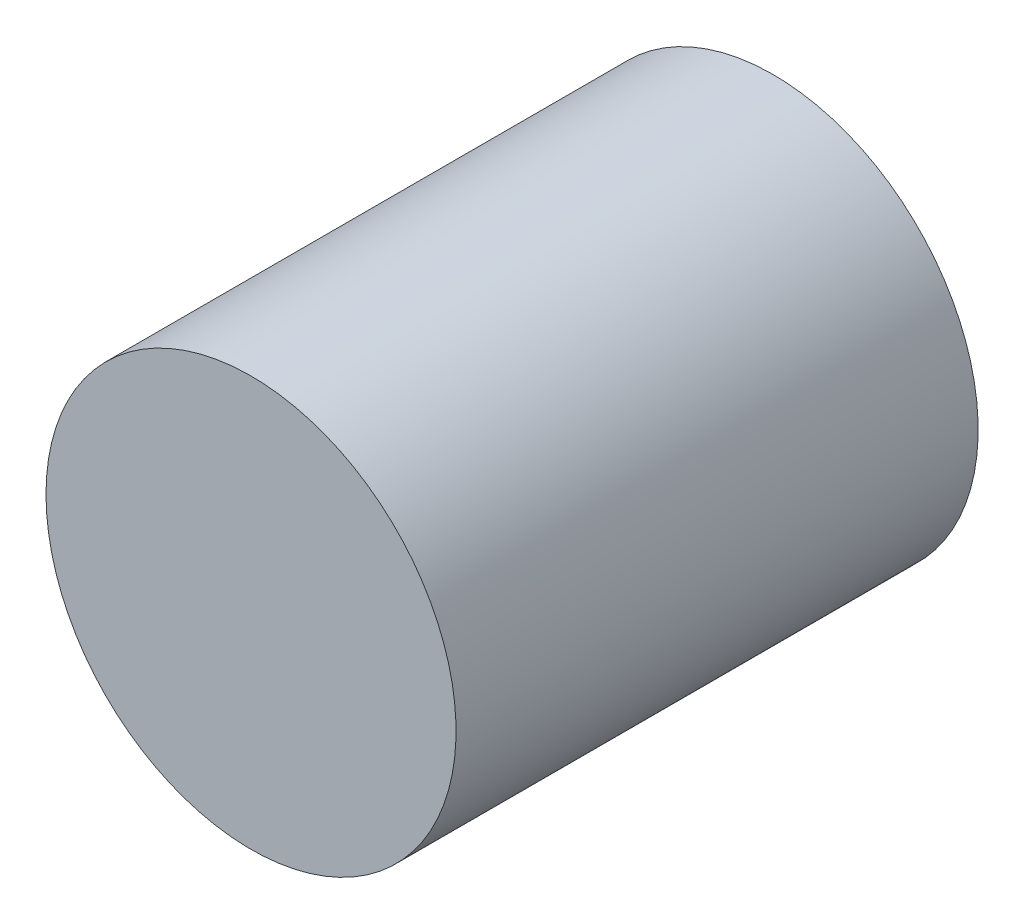
ISO-10303-21;
HEADER;
FILE_DESCRIPTION(('STEP AP214'),'2;1');
FILE_NAME('part.step','',(''),(''),'','','');
FILE_SCHEMA(('AUTOMOTIVE_DESIGN { 1 0 10303 214 1 1 1 1 }'));
ENDSEC;
DATA;
#1=APPLICATION_CONTEXT('core data for automotive mechanical design processes');
#2=APPLICATION_PROTOCOL_DEFINITION('international standard','automotive_design',2000,#1);
#3=PRODUCT_CONTEXT('',#1,'mechanical');
#4=PRODUCT('Part','Part','',(#3));
#5=PRODUCT_RELATED_PRODUCT_CATEGORY('part','',(#4));
#6=PRODUCT_DEFINITION_FORMATION('','',#4);
#7=PRODUCT_DEFINITION_CONTEXT('part definition',#1,'design');
#8=PRODUCT_DEFINITION('design','',#6,#7);
#9=PRODUCT_DEFINITION_SHAPE('','',#8);
#10=(LENGTH_UNIT() NAMED_UNIT(*) SI_UNIT(.MILLI.,.METRE.));
#11=(NAMED_UNIT(*) PLANE_ANGLE_UNIT() SI_UNIT($,.RADIAN.));
#12=(NAMED_UNIT(*) SI_UNIT($,.STERADIAN.) SOLID_ANGLE_UNIT());
#13=UNCERTAINTY_MEASURE_WITH_UNIT(LENGTH_MEASURE(1.E-05),#10,'distance_accuracy_value','');
#14=(GEOMETRIC_REPRESENTATION_CONTEXT(3) GLOBAL_UNCERTAINTY_ASSIGNED_CONTEXT((#13)) GLOBAL_UNIT_ASSIGNED_CONTEXT((#10,
#11,#12)) REPRESENTATION_CONTEXT('',''));
#15=CARTESIAN_POINT('',(0.,0.,0.));
#16=DIRECTION('',(0.,0.,1.));
#17=DIRECTION('',(1.,0.,0.));
#18=AXIS2_PLACEMENT_3D('',#15,#16,#17);
#19=CARTESIAN_POINT('',(0.,0.,120.));
#20=DIRECTION('',(0.,0.,-1.));
#21=DIRECTION('',(-1.,0.,0.));
#22=AXIS2_PLACEMENT_3D('',#19,#20,#21);
#23=CYLINDRICAL_SURFACE('',#22,47.1206619721996);
#24=CARTESIAN_POINT('',(0.,0.,120.));
#25=DIRECTION('',(0.,0.,1.));
#26=DIRECTION('',(1.,0.,0.));
#27=AXIS2_PLACEMENT_3D('',#24,#25,#26);
#28=CIRCLE('',#27,47.1206619721996);
#29=CARTESIAN_POINT('',(-47.1206619721996,0.,120.));
#30=VERTEX_POINT('',#29);
#31=EDGE_CURVE('E10',#30,#30,#28,.T.);
#32=CARTESIAN_POINT('',(0.,0.,0.));
#33=DIRECTION('',(0.,0.,1.));
#34=DIRECTION('',(1.,0.,0.));
#35=AXIS2_PLACEMENT_3D('',#32,#33,#34);
#36=CIRCLE('',#35,47.1206619721996);
#37=CARTESIAN_POINT('',(-47.1206619721996,0.,0.));
#38=VERTEX_POINT('',#37);
#39=EDGE_CURVE('E44',#38,#38,#36,.T.);
#40=CARTESIAN_POINT('',(-47.1206619721996,0.,120.));
#41=CARTESIAN_POINT('',(-47.1206619721996,0.,118.75));
#42=CARTESIAN_POINT('',(-47.1206619721996,0.,117.5));
#43=CARTESIAN_POINT('',(-47.1206619721996,0.,115.));
#44=CARTESIAN_POINT('',(-47.1206619721996,0.,113.75));
#45=CARTESIAN_POINT('',(-47.1206619721996,0.,111.25));
#46=CARTESIAN_POINT('',(-47.1206619721996,0.,110.));
#47=CARTESIAN_POINT('',(-47.1206619721996,0.,107.5));
#48=CARTESIAN_POINT('',(-47.1206619721996,0.,106.25));
#49=CARTESIAN_POINT('',(-47.1206619721996,0.,103.75));
#50=CARTESIAN_POINT('',(-47.1206619721996,0.,102.5));
#51=CARTESIAN_POINT('',(-47.1206619721996,0.,100.));
#52=CARTESIAN_POINT('',(-47.1206619721996,0.,98.75));
#53=CARTESIAN_POINT('',(-47.1206619721996,0.,96.25));
#54=CARTESIAN_POINT('',(-47.1206619721996,0.,95.));
#55=CARTESIAN_POINT('',(-47.1206619721996,0.,92.5));
#56=CARTESIAN_POINT('',(-47.1206619721996,0.,91.25));
#57=CARTESIAN_POINT('',(-47.1206619721996,0.,88.75));
#58=CARTESIAN_POINT('',(-47.1206619721996,0.,87.5));
#59=CARTESIAN_POINT('',(-47.1206619721996,0.,85.));
#60=CARTESIAN_POINT('',(-47.1206619721996,0.,83.75));
#61=CARTESIAN_POINT('',(-47.1206619721996,0.,81.25));
#62=CARTESIAN_POINT('',(-47.1206619721996,0.,80.));
#63=CARTESIAN_POINT('',(-47.1206619721996,0.,77.5));
#64=CARTESIAN_POINT('',(-47.1206619721996,0.,76.25));
#65=CARTESIAN_POINT('',(-47.1206619721996,0.,73.75));
#66=CARTESIAN_POINT('',(-47.1206619721996,0.,72.5));
#67=CARTESIAN_POINT('',(-47.1206619721996,0.,70.));
#68=CARTESIAN_POINT('',(-47.1206619721996,0.,68.75));
#69=CARTESIAN_POINT('',(-47.1206619721996,0.,66.25));
#70=CARTESIAN_POINT('',(-47.1206619721996,0.,65.));
#71=CARTESIAN_POINT('',(-47.1206619721996,0.,62.5));
#72=CARTESIAN_POINT('',(-47.1206619721996,0.,61.25));
#73=CARTESIAN_POINT('',(-47.1206619721996,0.,58.75));
#74=CARTESIAN_POINT('',(-47.1206619721996,0.,57.5));
#75=CARTESIAN_POINT('',(-47.1206619721996,0.,55.));
#76=CARTESIAN_POINT('',(-47.1206619721996,0.,53.75));
#77=CARTESIAN_POINT('',(-47.1206619721996,0.,51.25));
#78=CARTESIAN_POINT('',(-47.1206619721996,0.,50.));
#79=CARTESIAN_POINT('',(-47.1206619721996,0.,47.5));
#80=CARTESIAN_POINT('',(-47.1206619721996,0.,46.25));
#81=CARTESIAN_POINT('',(-47.1206619721996,0.,43.75));
#82=CARTESIAN_POINT('',(-47.1206619721996,0.,42.5));
#83=CARTESIAN_POINT('',(-47.1206619721996,0.,40.));
#84=CARTESIAN_POINT('',(-47.1206619721996,0.,38.75));
#85=CARTESIAN_POINT('',(-47.1206619721996,0.,36.25));
#86=CARTESIAN_POINT('',(-47.1206619721996,0.,35.));
#87=CARTESIAN_POINT('',(-47.1206619721996,0.,32.5));
#88=CARTESIAN_POINT('',(-47.1206619721996,0.,31.25));
#89=CARTESIAN_POINT('',(-47.1206619721996,0.,28.75));
#90=CARTESIAN_POINT('',(-47.1206619721996,0.,27.5));
#91=CARTESIAN_POINT('',(-47.1206619721996,0.,25.));
#92=CARTESIAN_POINT('',(-47.1206619721996,0.,23.75));
#93=CARTESIAN_POINT('',(-47.1206619721996,0.,21.25));
#94=CARTESIAN_POINT('',(-47.1206619721996,0.,20.));
#95=CARTESIAN_POINT('',(-47.1206619721996,0.,17.5));
#96=CARTESIAN_POINT('',(-47.1206619721996,0.,16.25));
#97=CARTESIAN_POINT('',(-47.1206619721996,0.,13.75));
#98=CARTESIAN_POINT('',(-47.1206619721996,0.,12.5));
#99=CARTESIAN_POINT('',(-47.1206619721996,0.,9.99999999999999));
#100=CARTESIAN_POINT('',(-47.1206619721996,0.,8.74999999999999));
#101=CARTESIAN_POINT('',(-47.1206619721996,0.,6.25));
#102=CARTESIAN_POINT('',(-47.1206619721996,0.,5.));
#103=CARTESIAN_POINT('',(-47.1206619721996,0.,2.5));
#104=CARTESIAN_POINT('',(-47.1206619721996,0.,1.25));
#105=CARTESIAN_POINT('',(-47.1206619721996,0.,0.));
#106=B_SPLINE_CURVE_WITH_KNOTS('',3,(#40,#41,#42,#43,#44,#45,#46,#47,#48,#49,#50,#51,#52,#53,
#54,#55,#56,#57,#58,#59,#60,#61,#62,#63,#64,#65,#66,#67,#68,#69,#70,#71,#72,#73,#74,#75,#76,#77,
#78,#79,#80,#81,#82,#83,#84,#85,#86,#87,#88,#89,#90,#91,#92,#93,#94,#95,#96,#97,#98,#99,#100,
#101,#102,#103,#104,#105),.UNSPECIFIED.,.F.,.F.,(4,2,2,2,2,2,2,2,2,2,2,2,2,2,2,2,2,2,2,2,2,2,2,
2,2,2,2,2,2,2,2,2,4),(0.,3.74999999999999,7.49999999999999,11.25,15.,18.75,22.5,26.25,30.,33.75,
37.5,41.25,45.,48.75,52.5,56.25,60.,63.75,67.5,71.25,75.,78.75,82.5,86.25,90.,93.75,97.5,101.25,
105.,108.75,112.5,116.25,120.),.UNSPECIFIED.);
#107=EDGE_CURVE('BSEAM41',#30,#38,#106,.T.);
#108=ORIENTED_EDGE('',*,*,#31,.F.);
#109=ORIENTED_EDGE('',*,*,#39,.T.);
#110=ORIENTED_EDGE('',*,*,#107,.T.);
#111=ORIENTED_EDGE('',*,*,#107,.F.);
#112=EDGE_LOOP('',(#108,#110,#109,#111));
#113=FACE_BOUND('',#112,.T.);
#114=ADVANCED_FACE('F41',(#113),#23,.T.);
#115=CARTESIAN_POINT('',(0.,0.,120.));
#116=DIRECTION('',(0.,0.,1.));
#117=DIRECTION('',(1.,0.,0.));
#118=AXIS2_PLACEMENT_3D('',#115,#116,#117);
#119=PLANE('',#118);
#120=ORIENTED_EDGE('',*,*,#31,.T.);
#121=EDGE_LOOP('',(#120));
#122=FACE_BOUND('',#121,.T.);
#123=ADVANCED_FACE('F58',(#122),#119,.T.);
#124=CARTESIAN_POINT('',(0.,0.,0.));
#125=DIRECTION('',(0.,0.,1.));
#126=DIRECTION('',(1.,0.,0.));
#127=AXIS2_PLACEMENT_3D('',#124,#125,#126);
#128=PLANE('',#127);
#129=ORIENTED_EDGE('',*,*,#39,.F.);
#130=EDGE_LOOP('',(#129));
#131=FACE_BOUND('',#130,.T.);
#132=ADVANCED_FACE('F56',(#131),#128,.F.);
#133=CLOSED_SHELL('',(#114,#123,#132));
#134=MANIFOLD_SOLID_BREP('B2',#133);
#135=ADVANCED_BREP_SHAPE_REPRESENTATION('',(#18,#134),#14);
#136=SHAPE_DEFINITION_REPRESENTATION(#9,#135);
ENDSEC;
END-ISO-10303-21;
